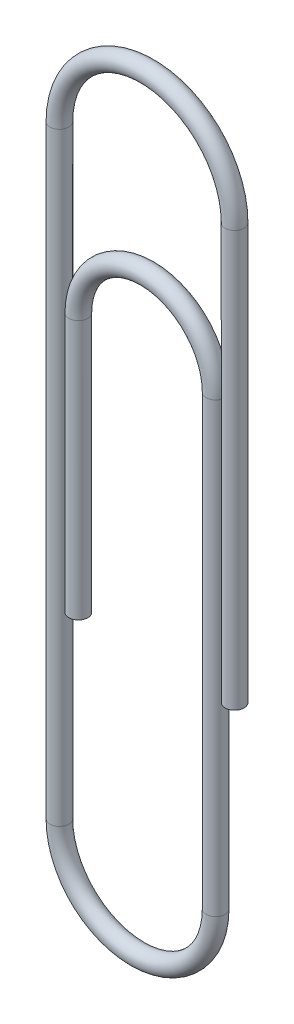
ISO-10303-21;
HEADER;
FILE_DESCRIPTION(('STEP AP214'),'2;1');
FILE_NAME('part.step','',(''),(''),'','','');
FILE_SCHEMA(('AUTOMOTIVE_DESIGN { 1 0 10303 214 1 1 1 1 }'));
ENDSEC;
DATA;
#1=APPLICATION_CONTEXT('core data for automotive mechanical design processes');
#2=APPLICATION_PROTOCOL_DEFINITION('international standard','automotive_design',2000,#1);
#3=PRODUCT_CONTEXT('',#1,'mechanical');
#4=PRODUCT('Part','Part','',(#3));
#5=PRODUCT_RELATED_PRODUCT_CATEGORY('part','',(#4));
#6=PRODUCT_DEFINITION_FORMATION('','',#4);
#7=PRODUCT_DEFINITION_CONTEXT('part definition',#1,'design');
#8=PRODUCT_DEFINITION('design','',#6,#7);
#9=PRODUCT_DEFINITION_SHAPE('','',#8);
#10=(LENGTH_UNIT() NAMED_UNIT(*) SI_UNIT(.MILLI.,.METRE.));
#11=(NAMED_UNIT(*) PLANE_ANGLE_UNIT() SI_UNIT($,.RADIAN.));
#12=(NAMED_UNIT(*) SI_UNIT($,.STERADIAN.) SOLID_ANGLE_UNIT());
#13=UNCERTAINTY_MEASURE_WITH_UNIT(LENGTH_MEASURE(1.E-05),#10,'distance_accuracy_value','');
#14=(GEOMETRIC_REPRESENTATION_CONTEXT(3) GLOBAL_UNCERTAINTY_ASSIGNED_CONTEXT((#13)) GLOBAL_UNIT_ASSIGNED_CONTEXT((#10,
#11,#12)) REPRESENTATION_CONTEXT('',''));
#15=CARTESIAN_POINT('',(0.,0.,0.));
#16=DIRECTION('',(0.,0.,1.));
#17=DIRECTION('',(1.,0.,0.));
#18=AXIS2_PLACEMENT_3D('',#15,#16,#17);
#19=CARTESIAN_POINT('',(0.,0.,0.));
#20=DIRECTION('',(0.,-1.,0.));
#21=DIRECTION('',(1.,0.,0.));
#22=AXIS2_PLACEMENT_3D('',#19,#20,#21);
#23=PLANE('',#22);
#24=CARTESIAN_POINT('',(0.,0.,0.));
#25=DIRECTION('',(0.,-1.,0.));
#26=DIRECTION('',(1.,0.,0.));
#27=AXIS2_PLACEMENT_3D('',#24,#25,#26);
#28=CIRCLE('',#27,0.40513);
#29=CARTESIAN_POINT('',(0.40513,0.,0.));
#30=VERTEX_POINT('',#29);
#31=EDGE_CURVE('E77',#30,#30,#28,.T.);
#32=ORIENTED_EDGE('',*,*,#31,.T.);
#33=EDGE_LOOP('',(#32));
#34=FACE_BOUND('',#33,.T.);
#35=ADVANCED_FACE('F49',(#34),#23,.T.);
#36=CARTESIAN_POINT('',(6.7056,0.,0.));
#37=DIRECTION('',(0.,1.,0.));
#38=DIRECTION('',(-1.,0.,0.));
#39=AXIS2_PLACEMENT_3D('',#36,#37,#38);
#40=PLANE('',#39);
#41=CARTESIAN_POINT('',(6.7056,0.,0.));
#42=DIRECTION('',(0.,1.,0.));
#43=DIRECTION('',(-1.,0.,0.));
#44=AXIS2_PLACEMENT_3D('',#41,#42,#43);
#45=CIRCLE('',#44,0.40513);
#46=CARTESIAN_POINT('',(6.30047,0.,0.));
#47=VERTEX_POINT('',#46);
#48=EDGE_CURVE('E11',#47,#47,#45,.T.);
#49=ORIENTED_EDGE('',*,*,#48,.F.);
#50=EDGE_LOOP('',(#49));
#51=FACE_BOUND('',#50,.T.);
#52=ADVANCED_FACE('F85',(#51),#40,.F.);
#53=CARTESIAN_POINT('',(0.,0.,0.));
#54=DIRECTION('',(0.,1.,0.));
#55=DIRECTION('',(-1.,0.,0.));
#56=AXIS2_PLACEMENT_3D('',#53,#54,#55);
#57=CYLINDRICAL_SURFACE('',#56,0.40513);
#58=CARTESIAN_POINT('',(0.,11.1252,0.));
#59=DIRECTION('',(0.,-1.,0.));
#60=DIRECTION('',(1.,0.,0.));
#61=AXIS2_PLACEMENT_3D('',#58,#59,#60);
#62=CIRCLE('',#61,0.40513);
#63=CARTESIAN_POINT('',(-0.40513,11.1252,0.));
#64=VERTEX_POINT('',#63);
#65=EDGE_CURVE('E74',#64,#64,#62,.T.);
#66=ORIENTED_EDGE('',*,*,#65,.T.);
#67=EDGE_LOOP('',(#66));
#68=FACE_BOUND('',#67,.T.);
#69=ORIENTED_EDGE('',*,*,#31,.F.);
#70=EDGE_LOOP('',(#69));
#71=FACE_BOUND('',#70,.T.);
#72=ADVANCED_FACE('F82',(#68,#71),#57,.T.);
#73=CARTESIAN_POINT('',(2.9464,11.1252,0.));
#74=DIRECTION('',(0.,0.,-1.));
#75=DIRECTION('',(-1.,0.,0.));
#76=AXIS2_PLACEMENT_3D('',#73,#74,#75);
#77=TOROIDAL_SURFACE('',#76,2.9464,0.40513);
#78=CARTESIAN_POINT('',(5.8928,11.1252,0.));
#79=DIRECTION('',(0.,1.,0.));
#80=DIRECTION('',(-1.,0.,0.));
#81=AXIS2_PLACEMENT_3D('',#78,#79,#80);
#82=CIRCLE('',#81,0.40513);
#83=CARTESIAN_POINT('',(6.29793,11.1252,0.));
#84=VERTEX_POINT('',#83);
#85=EDGE_CURVE('E71',#84,#84,#82,.T.);
#86=CARTESIAN_POINT('',(2.9464,11.1252,0.));
#87=DIRECTION('',(0.,0.,-1.));
#88=DIRECTION('',(-1.,0.,0.));
#89=AXIS2_PLACEMENT_3D('',#86,#87,#88);
#90=CIRCLE('',#89,3.35153);
#91=EDGE_CURVE('',#64,#84,#90,.T.);
#92=ORIENTED_EDGE('',*,*,#65,.F.);
#93=ORIENTED_EDGE('',*,*,#85,.T.);
#94=ORIENTED_EDGE('',*,*,#91,.T.);
#95=ORIENTED_EDGE('',*,*,#91,.F.);
#96=EDGE_LOOP('',(#92,#94,#93,#95));
#97=FACE_BOUND('',#96,.T.);
#98=ADVANCED_FACE('F84',(#97),#77,.T.);
#99=CARTESIAN_POINT('',(5.8928,11.1252,0.));
#100=DIRECTION('',(0.,-1.,0.));
#101=DIRECTION('',(1.,0.,0.));
#102=AXIS2_PLACEMENT_3D('',#99,#100,#101);
#103=CYLINDRICAL_SURFACE('',#102,0.40513);
#104=CARTESIAN_POINT('',(5.8928,-8.0772,0.));
#105=DIRECTION('',(0.,1.,0.));
#106=DIRECTION('',(-1.,0.,0.));
#107=AXIS2_PLACEMENT_3D('',#104,#105,#106);
#108=CIRCLE('',#107,0.40513);
#109=CARTESIAN_POINT('',(6.29793,-8.0772,0.));
#110=VERTEX_POINT('',#109);
#111=EDGE_CURVE('E68',#110,#110,#108,.T.);
#112=ORIENTED_EDGE('',*,*,#111,.T.);
#113=EDGE_LOOP('',(#112));
#114=FACE_BOUND('',#113,.T.);
#115=ORIENTED_EDGE('',*,*,#85,.F.);
#116=EDGE_LOOP('',(#115));
#117=FACE_BOUND('',#116,.T.);
#118=ADVANCED_FACE('F92',(#114,#117),#103,.T.);
#119=CARTESIAN_POINT('',(2.54,-8.0772,0.));
#120=DIRECTION('',(0.,0.,-1.));
#121=DIRECTION('',(-1.,0.,0.));
#122=AXIS2_PLACEMENT_3D('',#119,#120,#121);
#123=TOROIDAL_SURFACE('',#122,3.3528,0.40513);
#124=CARTESIAN_POINT('',(-0.812800000000002,-8.0772,0.));
#125=DIRECTION('',(0.,-1.,0.));
#126=DIRECTION('',(1.,0.,0.));
#127=AXIS2_PLACEMENT_3D('',#124,#125,#126);
#128=CIRCLE('',#127,0.40513);
#129=CARTESIAN_POINT('',(-1.21793,-8.0772,0.));
#130=VERTEX_POINT('',#129);
#131=EDGE_CURVE('E63',#130,#130,#128,.T.);
#132=CARTESIAN_POINT('',(2.54,-8.0772,0.));
#133=DIRECTION('',(0.,0.,-1.));
#134=DIRECTION('',(-1.,0.,0.));
#135=AXIS2_PLACEMENT_3D('',#132,#133,#134);
#136=CIRCLE('',#135,3.75793);
#137=EDGE_CURVE('',#110,#130,#136,.T.);
#138=ORIENTED_EDGE('',*,*,#111,.F.);
#139=ORIENTED_EDGE('',*,*,#131,.T.);
#140=ORIENTED_EDGE('',*,*,#137,.T.);
#141=ORIENTED_EDGE('',*,*,#137,.F.);
#142=EDGE_LOOP('',(#138,#140,#139,#141));
#143=FACE_BOUND('',#142,.T.);
#144=ADVANCED_FACE('F109',(#143),#123,.T.);
#145=CARTESIAN_POINT('',(-0.8128,-8.0772,0.));
#146=DIRECTION('',(0.,1.,0.));
#147=DIRECTION('',(0.,0.,1.));
#148=AXIS2_PLACEMENT_3D('',#145,#146,#147);
#149=CYLINDRICAL_SURFACE('',#148,0.40513);
#150=CARTESIAN_POINT('',(-0.8128,17.8308,0.));
#151=DIRECTION('',(0.,-1.,0.));
#152=DIRECTION('',(1.,0.,0.));
#153=AXIS2_PLACEMENT_3D('',#150,#151,#152);
#154=CIRCLE('',#153,0.40513);
#155=CARTESIAN_POINT('',(-1.21793,17.8308,0.));
#156=VERTEX_POINT('',#155);
#157=EDGE_CURVE('E59',#156,#156,#154,.T.);
#158=ORIENTED_EDGE('',*,*,#157,.T.);
#159=EDGE_LOOP('',(#158));
#160=FACE_BOUND('',#159,.T.);
#161=ORIENTED_EDGE('',*,*,#131,.F.);
#162=EDGE_LOOP('',(#161));
#163=FACE_BOUND('',#162,.T.);
#164=ADVANCED_FACE('F103',(#160,#163),#149,.T.);
#165=CARTESIAN_POINT('',(2.9464,17.8308,0.));
#166=DIRECTION('',(0.,0.,-1.));
#167=DIRECTION('',(-1.,0.,0.));
#168=AXIS2_PLACEMENT_3D('',#165,#166,#167);
#169=TOROIDAL_SURFACE('',#168,3.7592,0.40513);
#170=CARTESIAN_POINT('',(6.70559999999999,17.8308,0.));
#171=DIRECTION('',(0.,1.,0.));
#172=DIRECTION('',(-1.,0.,0.));
#173=AXIS2_PLACEMENT_3D('',#170,#171,#172);
#174=CIRCLE('',#173,0.40513);
#175=CARTESIAN_POINT('',(7.11072999999999,17.8308,0.));
#176=VERTEX_POINT('',#175);
#177=EDGE_CURVE('E55',#176,#176,#174,.T.);
#178=CARTESIAN_POINT('',(2.9464,17.8308,0.));
#179=DIRECTION('',(0.,0.,-1.));
#180=DIRECTION('',(-1.,0.,0.));
#181=AXIS2_PLACEMENT_3D('',#178,#179,#180);
#182=CIRCLE('',#181,4.16433);
#183=EDGE_CURVE('',#156,#176,#182,.T.);
#184=ORIENTED_EDGE('',*,*,#157,.F.);
#185=ORIENTED_EDGE('',*,*,#177,.T.);
#186=ORIENTED_EDGE('',*,*,#183,.T.);
#187=ORIENTED_EDGE('',*,*,#183,.F.);
#188=EDGE_LOOP('',(#184,#186,#185,#187));
#189=FACE_BOUND('',#188,.T.);
#190=ADVANCED_FACE('F98',(#189),#169,.T.);
#191=CARTESIAN_POINT('',(6.70559999999999,17.8308,0.));
#192=DIRECTION('',(0.,-1.,0.));
#193=DIRECTION('',(1.,0.,0.));
#194=AXIS2_PLACEMENT_3D('',#191,#192,#193);
#195=CYLINDRICAL_SURFACE('',#194,0.40513);
#196=ORIENTED_EDGE('',*,*,#48,.T.);
#197=EDGE_LOOP('',(#196));
#198=FACE_BOUND('',#197,.T.);
#199=ORIENTED_EDGE('',*,*,#177,.F.);
#200=EDGE_LOOP('',(#199));
#201=FACE_BOUND('',#200,.T.);
#202=ADVANCED_FACE('F96',(#198,#201),#195,.T.);
#203=CLOSED_SHELL('',(#35,#52,#72,#98,#118,#144,#164,#190,#202));
#204=MANIFOLD_SOLID_BREP('B2',#203);
#205=ADVANCED_BREP_SHAPE_REPRESENTATION('',(#18,#204),#14);
#206=SHAPE_DEFINITION_REPRESENTATION(#9,#205);
ENDSEC;
END-ISO-10303-21;
